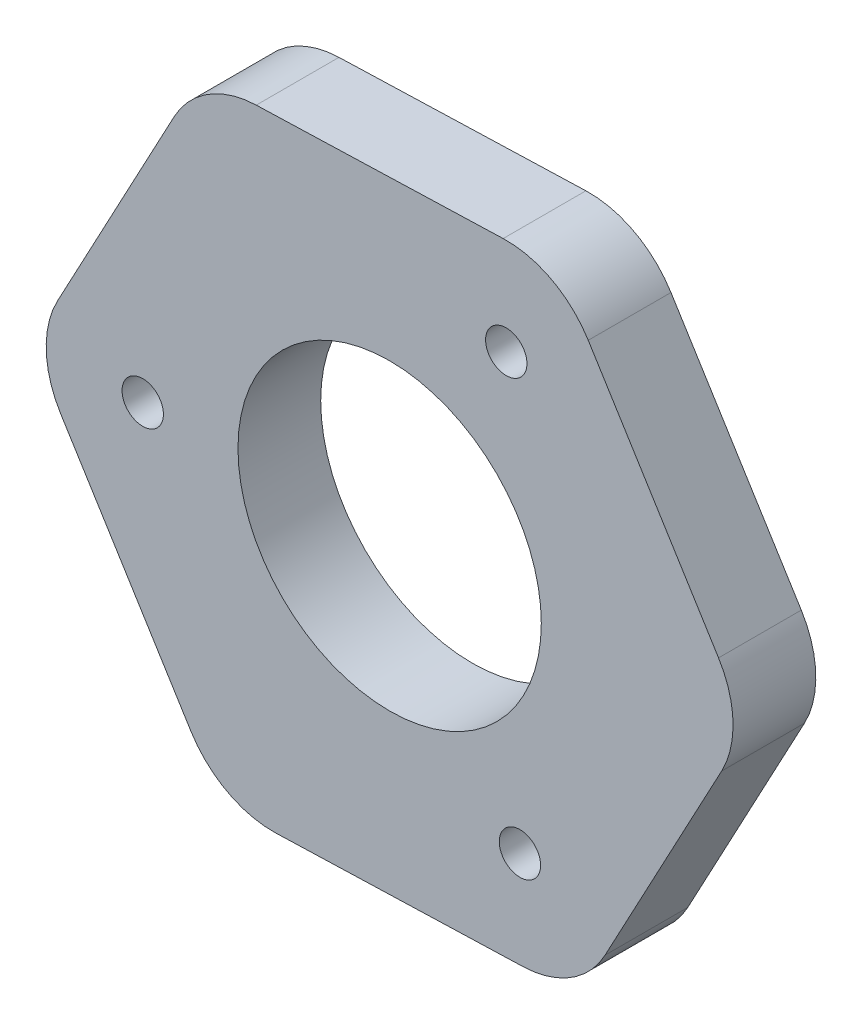
ISO-10303-21;
HEADER;
FILE_DESCRIPTION(('STEP AP214'),'2;1');
FILE_NAME('part.step','',(''),(''),'','','');
FILE_SCHEMA(('AUTOMOTIVE_DESIGN { 1 0 10303 214 1 1 1 1 }'));
ENDSEC;
DATA;
#1=APPLICATION_CONTEXT('core data for automotive mechanical design processes');
#2=APPLICATION_PROTOCOL_DEFINITION('international standard','automotive_design',2000,#1);
#3=PRODUCT_CONTEXT('',#1,'mechanical');
#4=PRODUCT('Part','Part','',(#3));
#5=PRODUCT_RELATED_PRODUCT_CATEGORY('part','',(#4));
#6=PRODUCT_DEFINITION_FORMATION('','',#4);
#7=PRODUCT_DEFINITION_CONTEXT('part definition',#1,'design');
#8=PRODUCT_DEFINITION('design','',#6,#7);
#9=PRODUCT_DEFINITION_SHAPE('','',#8);
#10=(LENGTH_UNIT() NAMED_UNIT(*) SI_UNIT(.MILLI.,.METRE.));
#11=(NAMED_UNIT(*) PLANE_ANGLE_UNIT() SI_UNIT($,.RADIAN.));
#12=(NAMED_UNIT(*) SI_UNIT($,.STERADIAN.) SOLID_ANGLE_UNIT());
#13=UNCERTAINTY_MEASURE_WITH_UNIT(LENGTH_MEASURE(1.E-05),#10,'distance_accuracy_value','');
#14=(GEOMETRIC_REPRESENTATION_CONTEXT(3) GLOBAL_UNCERTAINTY_ASSIGNED_CONTEXT((#13)) GLOBAL_UNIT_ASSIGNED_CONTEXT((#10,
#11,#12)) REPRESENTATION_CONTEXT('',''));
#15=CARTESIAN_POINT('',(0.,0.,0.));
#16=DIRECTION('',(0.,0.,1.));
#17=DIRECTION('',(1.,0.,0.));
#18=AXIS2_PLACEMENT_3D('',#15,#16,#17);
#19=CARTESIAN_POINT('',(38.8575541754875,373.393026576384,6.));
#20=DIRECTION('',(0.,0.,1.));
#21=DIRECTION('',(1.,0.,0.));
#22=AXIS2_PLACEMENT_3D('',#19,#20,#21);
#23=PLANE('',#22);
#24=CARTESIAN_POINT('',(30.4001110546253,357.597647719869,6.));
#25=DIRECTION('',(0.,0.,1.));
#26=DIRECTION('',(1.,0.,0.));
#27=AXIS2_PLACEMENT_3D('',#24,#25,#26);
#28=CIRCLE('',#27,1.50000000000174);
#29=CARTESIAN_POINT('',(31.900111054627,357.597647719869,6.));
#30=VERTEX_POINT('',#29);
#31=EDGE_CURVE('E298',#30,#30,#28,.T.);
#32=ORIENTED_EDGE('',*,*,#31,.F.);
#33=EDGE_LOOP('',(#32));
#34=FACE_BOUND('',#33,.T.);
#35=CARTESIAN_POINT('',(57.7585097588952,342.948926532412,6.));
#36=DIRECTION('',(0.,0.,1.));
#37=DIRECTION('',(1.,0.,0.));
#38=AXIS2_PLACEMENT_3D('',#35,#36,#37);
#39=CIRCLE('',#38,1.50000000000008);
#40=CARTESIAN_POINT('',(59.2585097588953,342.948926532412,6.));
#41=VERTEX_POINT('',#40);
#42=EDGE_CURVE('E165',#41,#41,#39,.T.);
#43=ORIENTED_EDGE('',*,*,#42,.F.);
#44=EDGE_LOOP('',(#43));
#45=FACE_BOUND('',#44,.T.);
#46=CARTESIAN_POINT('',(38.8575541754875,373.393026576384,6.));
#47=DIRECTION('',(0.,0.,1.));
#48=DIRECTION('',(1.,0.,0.));
#49=AXIS2_PLACEMENT_3D('',#46,#47,#48);
#50=CIRCLE('',#49,6.99999999999804);
#51=CARTESIAN_POINT('',(38.6335613035491,380.389441886619,6.));
#52=VERTEX_POINT('',#51);
#53=CARTESIAN_POINT('',(32.6864843454291,376.697250714137,6.));
#54=VERTEX_POINT('',#53);
#55=EDGE_CURVE('E184',#52,#54,#50,.T.);
#56=ORIENTED_EDGE('',*,*,#55,.T.);
#57=DIRECTION('',(-0.47203201967906,-0.881581404294412,0.));
#58=VECTOR('',#57,1.);
#59=CARTESIAN_POINT('',(32.6864843454291,376.697250714137,6.));
#60=LINE('',#59,#58);
#61=CARTESIAN_POINT('',(24.2290412245626,360.901871857628,6.));
#62=VERTEX_POINT('',#61);
#63=EDGE_CURVE('E112',#54,#62,#60,.T.);
#64=ORIENTED_EDGE('',*,*,#63,.T.);
#65=CARTESIAN_POINT('',(30.4001110546239,357.597647719875,6.));
#66=DIRECTION('',(0.,0.,1.));
#67=DIRECTION('',(1.,0.,0.));
#68=AXIS2_PLACEMENT_3D('',#65,#66,#67);
#69=CIRCLE('',#68,7.00000000000023);
#70=CARTESIAN_POINT('',(24.4530340965013,353.905456547391,6.));
#71=VERTEX_POINT('',#70);
#72=EDGE_CURVE('E211',#62,#71,#69,.T.);
#73=ORIENTED_EDGE('',*,*,#72,.T.);
#74=DIRECTION('',(0.527455881783454,-0.849582422588909,0.));
#75=VECTOR('',#74,1.);
#76=CARTESIAN_POINT('',(24.4530340965013,353.905456547391,6.));
#77=LINE('',#76,#75);
#78=CARTESIAN_POINT('',(33.9035118882053,338.683406525406,6.));
#79=VERTEX_POINT('',#78);
#80=EDGE_CURVE('E230',#71,#79,#77,.T.);
#81=ORIENTED_EDGE('',*,*,#80,.T.);
#82=CARTESIAN_POINT('',(39.8505888463291,342.37559769789,6.));
#83=DIRECTION('',(0.,0.,1.));
#84=DIRECTION('',(1.,0.,0.));
#85=AXIS2_PLACEMENT_3D('',#82,#83,#84);
#86=CIRCLE('',#85,7.0000000000012);
#87=CARTESIAN_POINT('',(40.0745817182654,335.379182387653,6.));
#88=VERTEX_POINT('',#87);
#89=EDGE_CURVE('E227',#79,#88,#86,.T.);
#90=ORIENTED_EDGE('',*,*,#89,.T.);
#91=DIRECTION('',(0.999487901462451,0.0319989817054562,0.));
#92=VECTOR('',#91,1.);
#93=CARTESIAN_POINT('',(40.0745817182654,335.379182387653,6.));
#94=LINE('',#93,#92);
#95=CARTESIAN_POINT('',(57.9825026308335,335.952511222174,6.));
#96=VERTEX_POINT('',#95);
#97=EDGE_CURVE('E229',#88,#96,#94,.T.);
#98=ORIENTED_EDGE('',*,*,#97,.T.);
#99=CARTESIAN_POINT('',(57.7585097588952,342.948926532412,6.));
#100=DIRECTION('',(0.,0.,1.));
#101=DIRECTION('',(1.,0.,0.));
#102=AXIS2_PLACEMENT_3D('',#99,#100,#101);
#103=CIRCLE('',#102,7.00000000000025);
#104=CARTESIAN_POINT('',(63.9295795889566,339.644702394659,6.));
#105=VERTEX_POINT('',#104);
#106=EDGE_CURVE('E232',#96,#105,#103,.T.);
#107=ORIENTED_EDGE('',*,*,#106,.T.);
#108=DIRECTION('',(0.472032019679039,0.881581404294423,0.));
#109=VECTOR('',#108,1.);
#110=CARTESIAN_POINT('',(63.9295795889566,339.644702394659,6.));
#111=LINE('',#110,#109);
#112=CARTESIAN_POINT('',(72.3870227098238,355.440081251168,6.));
#113=VERTEX_POINT('',#112);
#114=EDGE_CURVE('E238',#105,#113,#111,.T.);
#115=ORIENTED_EDGE('',*,*,#114,.T.);
#116=CARTESIAN_POINT('',(66.2159528797608,358.74430538892,6.));
#117=DIRECTION('',(0.,0.,1.));
#118=DIRECTION('',(1.,0.,0.));
#119=AXIS2_PLACEMENT_3D('',#116,#117,#118);
#120=CIRCLE('',#119,7.0000000000012);
#121=CARTESIAN_POINT('',(72.1630298378835,362.436496561407,6.));
#122=VERTEX_POINT('',#121);
#123=EDGE_CURVE('E143',#113,#122,#120,.T.);
#124=ORIENTED_EDGE('',*,*,#123,.T.);
#125=DIRECTION('',(-0.527455881783634,0.849582422588797,0.));
#126=VECTOR('',#125,1.);
#127=CARTESIAN_POINT('',(72.1630298378835,362.436496561407,6.));
#128=LINE('',#127,#126);
#129=CARTESIAN_POINT('',(62.7125520461777,377.658546583389,6.));
#130=VERTEX_POINT('',#129);
#131=EDGE_CURVE('E137',#122,#130,#128,.T.);
#132=ORIENTED_EDGE('',*,*,#131,.T.);
#133=CARTESIAN_POINT('',(56.7654750880555,373.966355410905,6.));
#134=DIRECTION('',(0.,0.,1.));
#135=DIRECTION('',(1.,0.,0.));
#136=AXIS2_PLACEMENT_3D('',#133,#134,#135);
#137=CIRCLE('',#136,7.);
#138=CARTESIAN_POINT('',(56.5414822161171,380.962770721142,6.));
#139=VERTEX_POINT('',#138);
#140=EDGE_CURVE('E141',#130,#139,#137,.T.);
#141=ORIENTED_EDGE('',*,*,#140,.T.);
#142=DIRECTION('',(-0.99948790146245,-0.0319989817054903,0.));
#143=VECTOR('',#142,1.);
#144=CARTESIAN_POINT('',(56.5414822161171,380.962770721142,6.));
#145=LINE('',#144,#143);
#146=EDGE_CURVE('E57',#139,#52,#145,.T.);
#147=ORIENTED_EDGE('',*,*,#146,.T.);
#148=EDGE_LOOP('',(#56,#64,#73,#81,#90,#98,#107,#115,#124,#132,#141,#147));
#149=FACE_BOUND('',#148,.T.);
#150=CARTESIAN_POINT('',(56.7654750880538,373.966355410907,6.));
#151=DIRECTION('',(0.,0.,1.));
#152=DIRECTION('',(1.,0.,0.));
#153=AXIS2_PLACEMENT_3D('',#150,#151,#152);
#154=CIRCLE('',#153,1.50000000000402);
#155=CARTESIAN_POINT('',(58.2654750880578,373.966355410907,6.));
#156=VERTEX_POINT('',#155);
#157=EDGE_CURVE('E304',#156,#156,#154,.T.);
#158=ORIENTED_EDGE('',*,*,#157,.F.);
#159=EDGE_LOOP('',(#158));
#160=FACE_BOUND('',#159,.T.);
#161=CARTESIAN_POINT('',(48.3080319671943,358.170976554396,6.));
#162=DIRECTION('',(0.,0.,1.));
#163=DIRECTION('',(1.,0.,0.));
#164=AXIS2_PLACEMENT_3D('',#161,#162,#163);
#165=CIRCLE('',#164,10.9999999999991);
#166=CARTESIAN_POINT('',(59.3080319671933,358.170976554396,6.));
#167=VERTEX_POINT('',#166);
#168=EDGE_CURVE('E289',#167,#167,#165,.T.);
#169=ORIENTED_EDGE('',*,*,#168,.F.);
#170=EDGE_LOOP('',(#169));
#171=FACE_BOUND('',#170,.T.);
#172=ADVANCED_FACE('F40',(#34,#45,#149,#160,#171),#23,.T.);
#173=CARTESIAN_POINT('',(38.8575541754875,373.393026576384,0.));
#174=DIRECTION('',(0.,0.,1.));
#175=DIRECTION('',(1.,0.,0.));
#176=AXIS2_PLACEMENT_3D('',#173,#174,#175);
#177=PLANE('',#176);
#178=CARTESIAN_POINT('',(38.8575541754875,373.393026576384,0.));
#179=DIRECTION('',(0.,0.,1.));
#180=DIRECTION('',(1.,0.,0.));
#181=AXIS2_PLACEMENT_3D('',#178,#179,#180);
#182=CIRCLE('',#181,6.99999999999804);
#183=CARTESIAN_POINT('',(38.6335613035491,380.389441886619,0.));
#184=VERTEX_POINT('',#183);
#185=CARTESIAN_POINT('',(32.6864843454291,376.697250714137,0.));
#186=VERTEX_POINT('',#185);
#187=EDGE_CURVE('E161',#184,#186,#182,.T.);
#188=ORIENTED_EDGE('',*,*,#187,.F.);
#189=DIRECTION('',(-0.99948790146245,-0.0319989817054903,0.));
#190=VECTOR('',#189,1.);
#191=CARTESIAN_POINT('',(56.5414822161171,380.962770721142,0.));
#192=LINE('',#191,#190);
#193=CARTESIAN_POINT('',(56.5414822161171,380.962770721142,0.));
#194=VERTEX_POINT('',#193);
#195=EDGE_CURVE('E104',#194,#184,#192,.T.);
#196=ORIENTED_EDGE('',*,*,#195,.F.);
#197=CARTESIAN_POINT('',(56.7654750880555,373.966355410905,0.));
#198=DIRECTION('',(0.,0.,1.));
#199=DIRECTION('',(1.,0.,0.));
#200=AXIS2_PLACEMENT_3D('',#197,#198,#199);
#201=CIRCLE('',#200,7.);
#202=CARTESIAN_POINT('',(62.7125520461777,377.658546583389,0.));
#203=VERTEX_POINT('',#202);
#204=EDGE_CURVE('E98',#203,#194,#201,.T.);
#205=ORIENTED_EDGE('',*,*,#204,.F.);
#206=DIRECTION('',(-0.527455881783634,0.849582422588797,0.));
#207=VECTOR('',#206,1.);
#208=CARTESIAN_POINT('',(72.1630298378835,362.436496561407,0.));
#209=LINE('',#208,#207);
#210=CARTESIAN_POINT('',(72.1630298378835,362.436496561407,0.));
#211=VERTEX_POINT('',#210);
#212=EDGE_CURVE('E151',#211,#203,#209,.T.);
#213=ORIENTED_EDGE('',*,*,#212,.F.);
#214=CARTESIAN_POINT('',(66.2159528797608,358.74430538892,0.));
#215=DIRECTION('',(0.,0.,1.));
#216=DIRECTION('',(1.,0.,0.));
#217=AXIS2_PLACEMENT_3D('',#214,#215,#216);
#218=CIRCLE('',#217,7.0000000000012);
#219=CARTESIAN_POINT('',(72.3870227098238,355.440081251168,0.));
#220=VERTEX_POINT('',#219);
#221=EDGE_CURVE('E179',#220,#211,#218,.T.);
#222=ORIENTED_EDGE('',*,*,#221,.F.);
#223=DIRECTION('',(0.472032019679039,0.881581404294423,0.));
#224=VECTOR('',#223,1.);
#225=CARTESIAN_POINT('',(63.9295795889566,339.644702394659,0.));
#226=LINE('',#225,#224);
#227=CARTESIAN_POINT('',(63.9295795889566,339.644702394659,0.));
#228=VERTEX_POINT('',#227);
#229=EDGE_CURVE('E177',#228,#220,#226,.T.);
#230=ORIENTED_EDGE('',*,*,#229,.F.);
#231=CARTESIAN_POINT('',(57.7585097588952,342.948926532412,0.));
#232=DIRECTION('',(0.,0.,1.));
#233=DIRECTION('',(1.,0.,0.));
#234=AXIS2_PLACEMENT_3D('',#231,#232,#233);
#235=CIRCLE('',#234,7.00000000000025);
#236=CARTESIAN_POINT('',(57.9825026308335,335.952511222174,0.));
#237=VERTEX_POINT('',#236);
#238=EDGE_CURVE('E175',#237,#228,#235,.T.);
#239=ORIENTED_EDGE('',*,*,#238,.F.);
#240=DIRECTION('',(0.999487901462451,0.0319989817054562,0.));
#241=VECTOR('',#240,1.);
#242=CARTESIAN_POINT('',(40.0745817182654,335.379182387653,0.));
#243=LINE('',#242,#241);
#244=CARTESIAN_POINT('',(40.0745817182654,335.379182387653,0.));
#245=VERTEX_POINT('',#244);
#246=EDGE_CURVE('E173',#245,#237,#243,.T.);
#247=ORIENTED_EDGE('',*,*,#246,.F.);
#248=CARTESIAN_POINT('',(39.8505888463291,342.37559769789,0.));
#249=DIRECTION('',(0.,0.,1.));
#250=DIRECTION('',(1.,0.,0.));
#251=AXIS2_PLACEMENT_3D('',#248,#249,#250);
#252=CIRCLE('',#251,7.0000000000012);
#253=CARTESIAN_POINT('',(33.9035118882053,338.683406525406,0.));
#254=VERTEX_POINT('',#253);
#255=EDGE_CURVE('E171',#254,#245,#252,.T.);
#256=ORIENTED_EDGE('',*,*,#255,.F.);
#257=DIRECTION('',(0.527455881783454,-0.849582422588909,0.));
#258=VECTOR('',#257,1.);
#259=CARTESIAN_POINT('',(24.4530340965013,353.905456547391,0.));
#260=LINE('',#259,#258);
#261=CARTESIAN_POINT('',(24.4530340965013,353.905456547391,0.));
#262=VERTEX_POINT('',#261);
#263=EDGE_CURVE('E169',#262,#254,#260,.T.);
#264=ORIENTED_EDGE('',*,*,#263,.F.);
#265=CARTESIAN_POINT('',(30.4001110546239,357.597647719875,0.));
#266=DIRECTION('',(0.,0.,1.));
#267=DIRECTION('',(1.,0.,0.));
#268=AXIS2_PLACEMENT_3D('',#265,#266,#267);
#269=CIRCLE('',#268,7.00000000000023);
#270=CARTESIAN_POINT('',(24.2290412245626,360.901871857628,0.));
#271=VERTEX_POINT('',#270);
#272=EDGE_CURVE('E167',#271,#262,#269,.T.);
#273=ORIENTED_EDGE('',*,*,#272,.F.);
#274=DIRECTION('',(-0.47203201967906,-0.881581404294412,0.));
#275=VECTOR('',#274,1.);
#276=CARTESIAN_POINT('',(32.6864843454291,376.697250714137,0.));
#277=LINE('',#276,#275);
#278=EDGE_CURVE('E164',#186,#271,#277,.T.);
#279=ORIENTED_EDGE('',*,*,#278,.F.);
#280=EDGE_LOOP('',(#188,#196,#205,#213,#222,#230,#239,#247,#256,#264,#273,#279));
#281=FACE_BOUND('',#280,.T.);
#282=CARTESIAN_POINT('',(57.7585097588952,342.948926532412,0.));
#283=DIRECTION('',(0.,0.,1.));
#284=DIRECTION('',(1.,0.,0.));
#285=AXIS2_PLACEMENT_3D('',#282,#283,#284);
#286=CIRCLE('',#285,1.50000000000008);
#287=CARTESIAN_POINT('',(59.2585097588953,342.948926532412,0.));
#288=VERTEX_POINT('',#287);
#289=EDGE_CURVE('E307',#288,#288,#286,.T.);
#290=ORIENTED_EDGE('',*,*,#289,.T.);
#291=EDGE_LOOP('',(#290));
#292=FACE_BOUND('',#291,.T.);
#293=CARTESIAN_POINT('',(56.7654750880538,373.966355410907,0.));
#294=DIRECTION('',(0.,0.,1.));
#295=DIRECTION('',(1.,0.,0.));
#296=AXIS2_PLACEMENT_3D('',#293,#294,#295);
#297=CIRCLE('',#296,1.50000000000402);
#298=CARTESIAN_POINT('',(58.2654750880578,373.966355410907,0.));
#299=VERTEX_POINT('',#298);
#300=EDGE_CURVE('E301',#299,#299,#297,.T.);
#301=ORIENTED_EDGE('',*,*,#300,.T.);
#302=EDGE_LOOP('',(#301));
#303=FACE_BOUND('',#302,.T.);
#304=CARTESIAN_POINT('',(30.4001110546253,357.597647719869,0.));
#305=DIRECTION('',(0.,0.,1.));
#306=DIRECTION('',(1.,0.,0.));
#307=AXIS2_PLACEMENT_3D('',#304,#305,#306);
#308=CIRCLE('',#307,1.50000000000174);
#309=CARTESIAN_POINT('',(31.900111054627,357.597647719869,0.));
#310=VERTEX_POINT('',#309);
#311=EDGE_CURVE('E295',#310,#310,#308,.T.);
#312=ORIENTED_EDGE('',*,*,#311,.T.);
#313=EDGE_LOOP('',(#312));
#314=FACE_BOUND('',#313,.T.);
#315=CARTESIAN_POINT('',(48.3080319671943,358.170976554396,0.));
#316=DIRECTION('',(0.,0.,1.));
#317=DIRECTION('',(1.,0.,0.));
#318=AXIS2_PLACEMENT_3D('',#315,#316,#317);
#319=CIRCLE('',#318,10.9999999999991);
#320=CARTESIAN_POINT('',(59.3080319671933,358.170976554396,0.));
#321=VERTEX_POINT('',#320);
#322=EDGE_CURVE('E292',#321,#321,#319,.T.);
#323=ORIENTED_EDGE('',*,*,#322,.T.);
#324=EDGE_LOOP('',(#323));
#325=FACE_BOUND('',#324,.T.);
#326=ADVANCED_FACE('F215',(#281,#292,#303,#314,#325),#177,.F.);
#327=CARTESIAN_POINT('',(38.8575541754875,373.393026576384,6.));
#328=DIRECTION('',(0.,0.,-1.));
#329=DIRECTION('',(-1.,0.,0.));
#330=AXIS2_PLACEMENT_3D('',#327,#328,#329);
#331=CYLINDRICAL_SURFACE('',#330,6.99999999999804);
#332=ORIENTED_EDGE('',*,*,#187,.T.);
#333=DIRECTION('',(0.,0.,-1.));
#334=VECTOR('',#333,1.);
#335=CARTESIAN_POINT('',(32.6864843454291,376.697250714137,6.));
#336=LINE('',#335,#334);
#337=EDGE_CURVE('E11',#54,#186,#336,.T.);
#338=ORIENTED_EDGE('',*,*,#337,.F.);
#339=ORIENTED_EDGE('',*,*,#55,.F.);
#340=DIRECTION('',(0.,0.,-1.));
#341=VECTOR('',#340,1.);
#342=CARTESIAN_POINT('',(38.6335613035491,380.389441886619,6.));
#343=LINE('',#342,#341);
#344=EDGE_CURVE('E157',#52,#184,#343,.T.);
#345=ORIENTED_EDGE('',*,*,#344,.T.);
#346=EDGE_LOOP('',(#332,#338,#339,#345));
#347=FACE_BOUND('',#346,.T.);
#348=ADVANCED_FACE('F42',(#347),#331,.T.);
#349=CARTESIAN_POINT('',(32.6864843454291,376.697250714137,6.));
#350=DIRECTION('',(0.881581404294412,-0.47203201967906,0.));
#351=DIRECTION('',(0.47203201967906,0.881581404294412,0.));
#352=AXIS2_PLACEMENT_3D('',#349,#350,#351);
#353=PLANE('',#352);
#354=ORIENTED_EDGE('',*,*,#278,.T.);
#355=DIRECTION('',(0.,0.,-1.));
#356=VECTOR('',#355,1.);
#357=CARTESIAN_POINT('',(24.2290412245626,360.901871857628,6.));
#358=LINE('',#357,#356);
#359=EDGE_CURVE('E49',#62,#271,#358,.T.);
#360=ORIENTED_EDGE('',*,*,#359,.F.);
#361=ORIENTED_EDGE('',*,*,#63,.F.);
#362=ORIENTED_EDGE('',*,*,#337,.T.);
#363=EDGE_LOOP('',(#354,#360,#361,#362));
#364=FACE_BOUND('',#363,.T.);
#365=ADVANCED_FACE('F427',(#364),#353,.F.);
#366=CARTESIAN_POINT('',(30.4001110546239,357.597647719875,6.));
#367=DIRECTION('',(0.,0.,-1.));
#368=DIRECTION('',(-1.,0.,0.));
#369=AXIS2_PLACEMENT_3D('',#366,#367,#368);
#370=CYLINDRICAL_SURFACE('',#369,7.00000000000023);
#371=ORIENTED_EDGE('',*,*,#272,.T.);
#372=DIRECTION('',(0.,0.,-1.));
#373=VECTOR('',#372,1.);
#374=CARTESIAN_POINT('',(24.4530340965013,353.905456547391,6.));
#375=LINE('',#374,#373);
#376=EDGE_CURVE('E203',#71,#262,#375,.T.);
#377=ORIENTED_EDGE('',*,*,#376,.F.);
#378=ORIENTED_EDGE('',*,*,#72,.F.);
#379=ORIENTED_EDGE('',*,*,#359,.T.);
#380=EDGE_LOOP('',(#371,#377,#378,#379));
#381=FACE_BOUND('',#380,.T.);
#382=ADVANCED_FACE('F209',(#381),#370,.T.);
#383=CARTESIAN_POINT('',(24.4530340965013,353.905456547391,6.));
#384=DIRECTION('',(0.849582422588908,0.527455881783454,0.));
#385=DIRECTION('',(-0.527455881783454,0.849582422588909,0.));
#386=AXIS2_PLACEMENT_3D('',#383,#384,#385);
#387=PLANE('',#386);
#388=ORIENTED_EDGE('',*,*,#263,.T.);
#389=DIRECTION('',(0.,0.,-1.));
#390=VECTOR('',#389,1.);
#391=CARTESIAN_POINT('',(33.9035118882053,338.683406525406,6.));
#392=LINE('',#391,#390);
#393=EDGE_CURVE('E200',#79,#254,#392,.T.);
#394=ORIENTED_EDGE('',*,*,#393,.F.);
#395=ORIENTED_EDGE('',*,*,#80,.F.);
#396=ORIENTED_EDGE('',*,*,#376,.T.);
#397=EDGE_LOOP('',(#388,#394,#395,#396));
#398=FACE_BOUND('',#397,.T.);
#399=ADVANCED_FACE('F221',(#398),#387,.F.);
#400=CARTESIAN_POINT('',(39.8505888463291,342.37559769789,6.));
#401=DIRECTION('',(0.,0.,-1.));
#402=DIRECTION('',(-1.,0.,0.));
#403=AXIS2_PLACEMENT_3D('',#400,#401,#402);
#404=CYLINDRICAL_SURFACE('',#403,7.0000000000012);
#405=ORIENTED_EDGE('',*,*,#255,.T.);
#406=DIRECTION('',(0.,0.,-1.));
#407=VECTOR('',#406,1.);
#408=CARTESIAN_POINT('',(40.0745817182654,335.379182387653,6.));
#409=LINE('',#408,#407);
#410=EDGE_CURVE('E197',#88,#245,#409,.T.);
#411=ORIENTED_EDGE('',*,*,#410,.F.);
#412=ORIENTED_EDGE('',*,*,#89,.F.);
#413=ORIENTED_EDGE('',*,*,#393,.T.);
#414=EDGE_LOOP('',(#405,#411,#412,#413));
#415=FACE_BOUND('',#414,.T.);
#416=ADVANCED_FACE('F225',(#415),#404,.T.);
#417=CARTESIAN_POINT('',(40.0745817182654,335.379182387653,6.));
#418=DIRECTION('',(-0.0319989817054562,0.999487901462451,0.));
#419=DIRECTION('',(-0.999487901462451,-0.0319989817054562,0.));
#420=AXIS2_PLACEMENT_3D('',#417,#418,#419);
#421=PLANE('',#420);
#422=ORIENTED_EDGE('',*,*,#246,.T.);
#423=DIRECTION('',(0.,0.,-1.));
#424=VECTOR('',#423,1.);
#425=CARTESIAN_POINT('',(57.9825026308335,335.952511222174,6.));
#426=LINE('',#425,#424);
#427=EDGE_CURVE('E194',#96,#237,#426,.T.);
#428=ORIENTED_EDGE('',*,*,#427,.F.);
#429=ORIENTED_EDGE('',*,*,#97,.F.);
#430=ORIENTED_EDGE('',*,*,#410,.T.);
#431=EDGE_LOOP('',(#422,#428,#429,#430));
#432=FACE_BOUND('',#431,.T.);
#433=ADVANCED_FACE('F388',(#432),#421,.F.);
#434=CARTESIAN_POINT('',(57.7585097588952,342.948926532412,6.));
#435=DIRECTION('',(0.,0.,-1.));
#436=DIRECTION('',(-1.,0.,0.));
#437=AXIS2_PLACEMENT_3D('',#434,#435,#436);
#438=CYLINDRICAL_SURFACE('',#437,7.00000000000025);
#439=ORIENTED_EDGE('',*,*,#238,.T.);
#440=DIRECTION('',(0.,0.,-1.));
#441=VECTOR('',#440,1.);
#442=CARTESIAN_POINT('',(63.9295795889566,339.644702394659,6.));
#443=LINE('',#442,#441);
#444=EDGE_CURVE('E191',#105,#228,#443,.T.);
#445=ORIENTED_EDGE('',*,*,#444,.F.);
#446=ORIENTED_EDGE('',*,*,#106,.F.);
#447=ORIENTED_EDGE('',*,*,#427,.T.);
#448=EDGE_LOOP('',(#439,#445,#446,#447));
#449=FACE_BOUND('',#448,.T.);
#450=ADVANCED_FACE('F378',(#449),#438,.T.);
#451=CARTESIAN_POINT('',(63.9295795889566,339.644702394659,6.));
#452=DIRECTION('',(-0.881581404294423,0.472032019679039,0.));
#453=DIRECTION('',(-0.472032019679039,-0.881581404294423,0.));
#454=AXIS2_PLACEMENT_3D('',#451,#452,#453);
#455=PLANE('',#454);
#456=ORIENTED_EDGE('',*,*,#229,.T.);
#457=DIRECTION('',(0.,0.,-1.));
#458=VECTOR('',#457,1.);
#459=CARTESIAN_POINT('',(72.3870227098238,355.440081251168,6.));
#460=LINE('',#459,#458);
#461=EDGE_CURVE('E188',#113,#220,#460,.T.);
#462=ORIENTED_EDGE('',*,*,#461,.F.);
#463=ORIENTED_EDGE('',*,*,#114,.F.);
#464=ORIENTED_EDGE('',*,*,#444,.T.);
#465=EDGE_LOOP('',(#456,#462,#463,#464));
#466=FACE_BOUND('',#465,.T.);
#467=ADVANCED_FACE('F244',(#466),#455,.F.);
#468=CARTESIAN_POINT('',(66.2159528797608,358.74430538892,6.));
#469=DIRECTION('',(0.,0.,-1.));
#470=DIRECTION('',(-1.,0.,0.));
#471=AXIS2_PLACEMENT_3D('',#468,#469,#470);
#472=CYLINDRICAL_SURFACE('',#471,7.0000000000012);
#473=ORIENTED_EDGE('',*,*,#221,.T.);
#474=DIRECTION('',(0.,0.,-1.));
#475=VECTOR('',#474,1.);
#476=CARTESIAN_POINT('',(72.1630298378835,362.436496561407,6.));
#477=LINE('',#476,#475);
#478=EDGE_CURVE('E152',#122,#211,#477,.T.);
#479=ORIENTED_EDGE('',*,*,#478,.F.);
#480=ORIENTED_EDGE('',*,*,#123,.F.);
#481=ORIENTED_EDGE('',*,*,#461,.T.);
#482=EDGE_LOOP('',(#473,#479,#480,#481));
#483=FACE_BOUND('',#482,.T.);
#484=ADVANCED_FACE('F248',(#483),#472,.T.);
#485=CARTESIAN_POINT('',(72.1630298378835,362.436496561407,6.));
#486=DIRECTION('',(-0.849582422588797,-0.527455881783634,0.));
#487=DIRECTION('',(0.527455881783634,-0.849582422588797,0.));
#488=AXIS2_PLACEMENT_3D('',#485,#486,#487);
#489=PLANE('',#488);
#490=ORIENTED_EDGE('',*,*,#212,.T.);
#491=DIRECTION('',(0.,0.,-1.));
#492=VECTOR('',#491,1.);
#493=CARTESIAN_POINT('',(62.7125520461777,377.658546583389,6.));
#494=LINE('',#493,#492);
#495=EDGE_CURVE('E148',#130,#203,#494,.T.);
#496=ORIENTED_EDGE('',*,*,#495,.F.);
#497=ORIENTED_EDGE('',*,*,#131,.F.);
#498=ORIENTED_EDGE('',*,*,#478,.T.);
#499=EDGE_LOOP('',(#490,#496,#497,#498));
#500=FACE_BOUND('',#499,.T.);
#501=ADVANCED_FACE('F149',(#500),#489,.F.);
#502=CARTESIAN_POINT('',(56.7654750880555,373.966355410905,6.));
#503=DIRECTION('',(0.,0.,-1.));
#504=DIRECTION('',(-1.,0.,0.));
#505=AXIS2_PLACEMENT_3D('',#502,#503,#504);
#506=CYLINDRICAL_SURFACE('',#505,7.);
#507=ORIENTED_EDGE('',*,*,#204,.T.);
#508=DIRECTION('',(0.,0.,-1.));
#509=VECTOR('',#508,1.);
#510=CARTESIAN_POINT('',(56.5414822161171,380.962770721142,6.));
#511=LINE('',#510,#509);
#512=EDGE_CURVE('E153',#139,#194,#511,.T.);
#513=ORIENTED_EDGE('',*,*,#512,.F.);
#514=ORIENTED_EDGE('',*,*,#140,.F.);
#515=ORIENTED_EDGE('',*,*,#495,.T.);
#516=EDGE_LOOP('',(#507,#513,#514,#515));
#517=FACE_BOUND('',#516,.T.);
#518=ADVANCED_FACE('F155',(#517),#506,.T.);
#519=CARTESIAN_POINT('',(56.5414822161171,380.962770721142,6.));
#520=DIRECTION('',(0.0319989817054903,-0.99948790146245,0.));
#521=DIRECTION('',(0.99948790146245,0.0319989817054903,0.));
#522=AXIS2_PLACEMENT_3D('',#519,#520,#521);
#523=PLANE('',#522);
#524=ORIENTED_EDGE('',*,*,#195,.T.);
#525=ORIENTED_EDGE('',*,*,#344,.F.);
#526=ORIENTED_EDGE('',*,*,#146,.F.);
#527=ORIENTED_EDGE('',*,*,#512,.T.);
#528=EDGE_LOOP('',(#524,#525,#526,#527));
#529=FACE_BOUND('',#528,.T.);
#530=ADVANCED_FACE('F252',(#529),#523,.F.);
#531=CARTESIAN_POINT('',(57.7585097588952,342.948926532412,6.));
#532=DIRECTION('',(0.,0.,-1.));
#533=DIRECTION('',(-1.,0.,0.));
#534=AXIS2_PLACEMENT_3D('',#531,#532,#533);
#535=CYLINDRICAL_SURFACE('',#534,1.50000000000008);
#536=ORIENTED_EDGE('',*,*,#42,.T.);
#537=EDGE_LOOP('',(#536));
#538=FACE_BOUND('',#537,.T.);
#539=ORIENTED_EDGE('',*,*,#289,.F.);
#540=EDGE_LOOP('',(#539));
#541=FACE_BOUND('',#540,.T.);
#542=ADVANCED_FACE('F254',(#538,#541),#535,.F.);
#543=CARTESIAN_POINT('',(56.7654750880538,373.966355410907,6.));
#544=DIRECTION('',(0.,0.,-1.));
#545=DIRECTION('',(-1.,0.,0.));
#546=AXIS2_PLACEMENT_3D('',#543,#544,#545);
#547=CYLINDRICAL_SURFACE('',#546,1.50000000000402);
#548=ORIENTED_EDGE('',*,*,#157,.T.);
#549=EDGE_LOOP('',(#548));
#550=FACE_BOUND('',#549,.T.);
#551=ORIENTED_EDGE('',*,*,#300,.F.);
#552=EDGE_LOOP('',(#551));
#553=FACE_BOUND('',#552,.T.);
#554=ADVANCED_FACE('F260',(#550,#553),#547,.F.);
#555=CARTESIAN_POINT('',(30.4001110546253,357.597647719869,6.));
#556=DIRECTION('',(0.,0.,-1.));
#557=DIRECTION('',(-1.,0.,0.));
#558=AXIS2_PLACEMENT_3D('',#555,#556,#557);
#559=CYLINDRICAL_SURFACE('',#558,1.50000000000174);
#560=ORIENTED_EDGE('',*,*,#31,.T.);
#561=EDGE_LOOP('',(#560));
#562=FACE_BOUND('',#561,.T.);
#563=ORIENTED_EDGE('',*,*,#311,.F.);
#564=EDGE_LOOP('',(#563));
#565=FACE_BOUND('',#564,.T.);
#566=ADVANCED_FACE('F276',(#562,#565),#559,.F.);
#567=CARTESIAN_POINT('',(48.3080319671943,358.170976554396,6.));
#568=DIRECTION('',(0.,0.,-1.));
#569=DIRECTION('',(-1.,0.,0.));
#570=AXIS2_PLACEMENT_3D('',#567,#568,#569);
#571=CYLINDRICAL_SURFACE('',#570,10.9999999999991);
#572=ORIENTED_EDGE('',*,*,#168,.T.);
#573=EDGE_LOOP('',(#572));
#574=FACE_BOUND('',#573,.T.);
#575=ORIENTED_EDGE('',*,*,#322,.F.);
#576=EDGE_LOOP('',(#575));
#577=FACE_BOUND('',#576,.T.);
#578=ADVANCED_FACE('F280',(#574,#577),#571,.F.);
#579=CLOSED_SHELL('',(#172,#326,#348,#365,#382,#399,#416,#433,#450,#467,#484,#501,#518,#530,
#542,#554,#566,#578));
#580=MANIFOLD_SOLID_BREP('B2',#579);
#581=ADVANCED_BREP_SHAPE_REPRESENTATION('',(#18,#580),#14);
#582=SHAPE_DEFINITION_REPRESENTATION(#9,#581);
ENDSEC;
END-ISO-10303-21;
